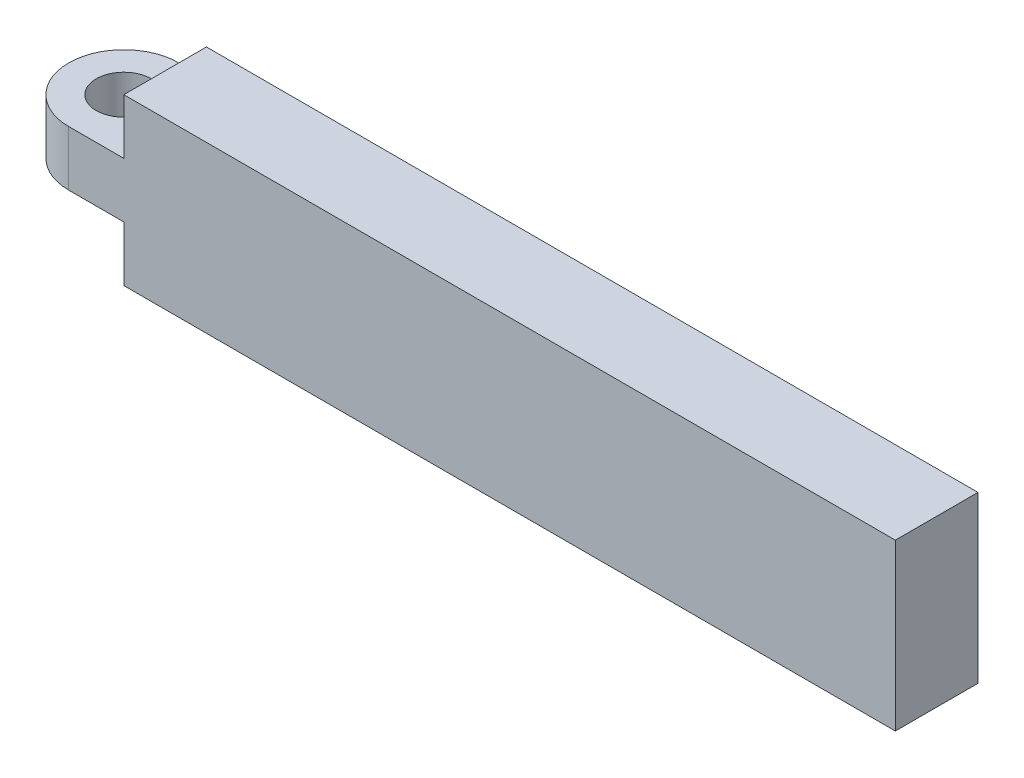
ISO-10303-21;
HEADER;
FILE_DESCRIPTION(('STEP AP214'),'2;1');
FILE_NAME('part.step','',(''),(''),'','','');
FILE_SCHEMA(('AUTOMOTIVE_DESIGN { 1 0 10303 214 1 1 1 1 }'));
ENDSEC;
DATA;
#1=APPLICATION_CONTEXT('core data for automotive mechanical design processes');
#2=APPLICATION_PROTOCOL_DEFINITION('international standard','automotive_design',2000,#1);
#3=PRODUCT_CONTEXT('',#1,'mechanical');
#4=PRODUCT('Part','Part','',(#3));
#5=PRODUCT_RELATED_PRODUCT_CATEGORY('part','',(#4));
#6=PRODUCT_DEFINITION_FORMATION('','',#4);
#7=PRODUCT_DEFINITION_CONTEXT('part definition',#1,'design');
#8=PRODUCT_DEFINITION('design','',#6,#7);
#9=PRODUCT_DEFINITION_SHAPE('','',#8);
#10=(LENGTH_UNIT() NAMED_UNIT(*) SI_UNIT(.MILLI.,.METRE.));
#11=(NAMED_UNIT(*) PLANE_ANGLE_UNIT() SI_UNIT($,.RADIAN.));
#12=(NAMED_UNIT(*) SI_UNIT($,.STERADIAN.) SOLID_ANGLE_UNIT());
#13=UNCERTAINTY_MEASURE_WITH_UNIT(LENGTH_MEASURE(1.E-05),#10,'distance_accuracy_value','');
#14=(GEOMETRIC_REPRESENTATION_CONTEXT(3) GLOBAL_UNCERTAINTY_ASSIGNED_CONTEXT((#13)) GLOBAL_UNIT_ASSIGNED_CONTEXT((#10,
#11,#12)) REPRESENTATION_CONTEXT('',''));
#15=CARTESIAN_POINT('',(0.,0.,0.));
#16=DIRECTION('',(0.,0.,1.));
#17=DIRECTION('',(1.,0.,0.));
#18=AXIS2_PLACEMENT_3D('',#15,#16,#17);
#19=CARTESIAN_POINT('',(-9.,2.,-1.));
#20=DIRECTION('',(0.,-1.,0.));
#21=DIRECTION('',(0.,0.,-1.));
#22=AXIS2_PLACEMENT_3D('',#19,#20,#21);
#23=PLANE('',#22);
#24=CARTESIAN_POINT('',(-8.,2.,0.));
#25=DIRECTION('',(0.,1.,0.));
#26=DIRECTION('',(0.,0.,1.));
#27=AXIS2_PLACEMENT_3D('',#24,#25,#26);
#28=CIRCLE('',#27,0.5);
#29=CARTESIAN_POINT('',(-8.,2.,0.5));
#30=VERTEX_POINT('',#29);
#31=EDGE_CURVE('E207',#30,#30,#28,.T.);
#32=ORIENTED_EDGE('',*,*,#31,.F.);
#33=EDGE_LOOP('',(#32));
#34=FACE_BOUND('',#33,.T.);
#35=CARTESIAN_POINT('',(-8.,2.,0.));
#36=DIRECTION('',(0.,1.,0.));
#37=DIRECTION('',(0.,0.,1.));
#38=AXIS2_PLACEMENT_3D('',#35,#36,#37);
#39=CIRCLE('',#38,1.);
#40=CARTESIAN_POINT('',(-8.,2.,-1.));
#41=VERTEX_POINT('',#40);
#42=CARTESIAN_POINT('',(-8.,2.,1.));
#43=VERTEX_POINT('',#42);
#44=EDGE_CURVE('E136',#41,#43,#39,.T.);
#45=ORIENTED_EDGE('',*,*,#44,.T.);
#46=DIRECTION('',(1.,0.,0.));
#47=VECTOR('',#46,1.);
#48=CARTESIAN_POINT('',(-9.,2.,1.));
#49=LINE('',#48,#47);
#50=CARTESIAN_POINT('',(-7.,2.,1.));
#51=VERTEX_POINT('',#50);
#52=EDGE_CURVE('E82',#43,#51,#49,.T.);
#53=ORIENTED_EDGE('',*,*,#52,.T.);
#54=DIRECTION('',(0.,0.,-1.));
#55=VECTOR('',#54,1.);
#56=CARTESIAN_POINT('',(-7.,2.,-1.));
#57=LINE('',#56,#55);
#58=CARTESIAN_POINT('',(-7.,2.,-1.));
#59=VERTEX_POINT('',#58);
#60=EDGE_CURVE('E202',#51,#59,#57,.T.);
#61=ORIENTED_EDGE('',*,*,#60,.T.);
#62=DIRECTION('',(1.,0.,0.));
#63=VECTOR('',#62,1.);
#64=CARTESIAN_POINT('',(-9.,2.,-1.));
#65=LINE('',#64,#63);
#66=EDGE_CURVE('E137',#41,#59,#65,.T.);
#67=ORIENTED_EDGE('',*,*,#66,.F.);
#68=EDGE_LOOP('',(#45,#53,#61,#67));
#69=FACE_BOUND('',#68,.T.);
#70=ADVANCED_FACE('F58',(#34,#69),#23,.F.);
#71=CARTESIAN_POINT('',(-9.,1.,-1.));
#72=DIRECTION('',(0.,1.,0.));
#73=DIRECTION('',(0.,0.,1.));
#74=AXIS2_PLACEMENT_3D('',#71,#72,#73);
#75=PLANE('',#74);
#76=CARTESIAN_POINT('',(-8.,1.,0.));
#77=DIRECTION('',(0.,1.,0.));
#78=DIRECTION('',(0.,0.,1.));
#79=AXIS2_PLACEMENT_3D('',#76,#77,#78);
#80=CIRCLE('',#79,0.5);
#81=CARTESIAN_POINT('',(-8.,1.,0.5));
#82=VERTEX_POINT('',#81);
#83=EDGE_CURVE('E200',#82,#82,#80,.T.);
#84=ORIENTED_EDGE('',*,*,#83,.T.);
#85=EDGE_LOOP('',(#84));
#86=FACE_BOUND('',#85,.T.);
#87=DIRECTION('',(1.,0.,0.));
#88=VECTOR('',#87,1.);
#89=CARTESIAN_POINT('',(-9.,1.,1.));
#90=LINE('',#89,#88);
#91=CARTESIAN_POINT('',(-8.,1.,1.));
#92=VERTEX_POINT('',#91);
#93=CARTESIAN_POINT('',(-7.,1.,1.));
#94=VERTEX_POINT('',#93);
#95=EDGE_CURVE('E74',#92,#94,#90,.T.);
#96=ORIENTED_EDGE('',*,*,#95,.F.);
#97=CARTESIAN_POINT('',(-8.,1.,0.));
#98=DIRECTION('',(0.,1.,0.));
#99=DIRECTION('',(0.,0.,1.));
#100=AXIS2_PLACEMENT_3D('',#97,#98,#99);
#101=CIRCLE('',#100,1.);
#102=CARTESIAN_POINT('',(-8.,1.,-1.));
#103=VERTEX_POINT('',#102);
#104=EDGE_CURVE('E144',#103,#92,#101,.T.);
#105=ORIENTED_EDGE('',*,*,#104,.F.);
#106=DIRECTION('',(1.,0.,0.));
#107=VECTOR('',#106,1.);
#108=CARTESIAN_POINT('',(-9.,1.,-1.));
#109=LINE('',#108,#107);
#110=CARTESIAN_POINT('',(-7.,1.,-1.));
#111=VERTEX_POINT('',#110);
#112=EDGE_CURVE('E155',#103,#111,#109,.T.);
#113=ORIENTED_EDGE('',*,*,#112,.T.);
#114=DIRECTION('',(0.,0.,1.));
#115=VECTOR('',#114,1.);
#116=CARTESIAN_POINT('',(-7.,1.,-1.));
#117=LINE('',#116,#115);
#118=EDGE_CURVE('E205',#111,#94,#117,.T.);
#119=ORIENTED_EDGE('',*,*,#118,.T.);
#120=EDGE_LOOP('',(#96,#105,#113,#119));
#121=FACE_BOUND('',#120,.T.);
#122=ADVANCED_FACE('F218',(#86,#121),#75,.F.);
#123=CARTESIAN_POINT('',(-7.,3.,1.));
#124=DIRECTION('',(0.,0.,-1.));
#125=DIRECTION('',(-1.,0.,0.));
#126=AXIS2_PLACEMENT_3D('',#123,#124,#125);
#127=PLANE('',#126);
#128=DIRECTION('',(0.,1.,0.));
#129=VECTOR('',#128,1.);
#130=CARTESIAN_POINT('',(-8.,0.,1.));
#131=LINE('',#130,#129);
#132=EDGE_CURVE('E12',#92,#43,#131,.T.);
#133=ORIENTED_EDGE('',*,*,#132,.F.);
#134=ORIENTED_EDGE('',*,*,#95,.T.);
#135=DIRECTION('',(0.,-1.,0.));
#136=VECTOR('',#135,1.);
#137=CARTESIAN_POINT('',(-7.,3.,1.));
#138=LINE('',#137,#136);
#139=CARTESIAN_POINT('',(-7.,0.,1.));
#140=VERTEX_POINT('',#139);
#141=EDGE_CURVE('E177',#94,#140,#138,.T.);
#142=ORIENTED_EDGE('',*,*,#141,.T.);
#143=DIRECTION('',(1.,0.,0.));
#144=VECTOR('',#143,1.);
#145=CARTESIAN_POINT('',(-7.,0.,1.));
#146=LINE('',#145,#144);
#147=CARTESIAN_POINT('',(7.,0.,1.));
#148=VERTEX_POINT('',#147);
#149=EDGE_CURVE('E163',#140,#148,#146,.T.);
#150=ORIENTED_EDGE('',*,*,#149,.T.);
#151=DIRECTION('',(0.,-1.,0.));
#152=VECTOR('',#151,1.);
#153=CARTESIAN_POINT('',(7.,3.,1.));
#154=LINE('',#153,#152);
#155=CARTESIAN_POINT('',(7.,3.,1.));
#156=VERTEX_POINT('',#155);
#157=EDGE_CURVE('E167',#156,#148,#154,.T.);
#158=ORIENTED_EDGE('',*,*,#157,.F.);
#159=DIRECTION('',(1.,0.,0.));
#160=VECTOR('',#159,1.);
#161=CARTESIAN_POINT('',(-7.,3.,1.));
#162=LINE('',#161,#160);
#163=CARTESIAN_POINT('',(-7.,3.,1.));
#164=VERTEX_POINT('',#163);
#165=EDGE_CURVE('E165',#164,#156,#162,.T.);
#166=ORIENTED_EDGE('',*,*,#165,.F.);
#167=EDGE_CURVE('E149',#164,#51,#138,.T.);
#168=ORIENTED_EDGE('',*,*,#167,.T.);
#169=ORIENTED_EDGE('',*,*,#52,.F.);
#170=EDGE_LOOP('',(#133,#134,#142,#150,#158,#166,#168,#169));
#171=FACE_BOUND('',#170,.T.);
#172=ADVANCED_FACE('F146',(#171),#127,.F.);
#173=CARTESIAN_POINT('',(-7.,3.,-1.));
#174=DIRECTION('',(1.,0.,0.));
#175=DIRECTION('',(0.,0.,-1.));
#176=AXIS2_PLACEMENT_3D('',#173,#174,#175);
#177=PLANE('',#176);
#178=ORIENTED_EDGE('',*,*,#118,.F.);
#179=DIRECTION('',(0.,-1.,0.));
#180=VECTOR('',#179,1.);
#181=CARTESIAN_POINT('',(-7.,3.,-1.));
#182=LINE('',#181,#180);
#183=CARTESIAN_POINT('',(-7.,0.5,-1.));
#184=VERTEX_POINT('',#183);
#185=EDGE_CURVE('E179',#111,#184,#182,.T.);
#186=ORIENTED_EDGE('',*,*,#185,.T.);
#187=DIRECTION('',(0.,0.707106781186549,-0.707106781186546));
#188=VECTOR('',#187,1.);
#189=CARTESIAN_POINT('',(-7.,0.5,-1.));
#190=LINE('',#189,#188);
#191=CARTESIAN_POINT('',(-7.,0.,-0.500000000000001));
#192=VERTEX_POINT('',#191);
#193=EDGE_CURVE('E192',#184,#192,#190,.F.);
#194=ORIENTED_EDGE('',*,*,#193,.T.);
#195=DIRECTION('',(0.,0.,1.));
#196=VECTOR('',#195,1.);
#197=CARTESIAN_POINT('',(-7.,0.,-1.));
#198=LINE('',#197,#196);
#199=EDGE_CURVE('E171',#192,#140,#198,.T.);
#200=ORIENTED_EDGE('',*,*,#199,.T.);
#201=ORIENTED_EDGE('',*,*,#141,.F.);
#202=EDGE_LOOP('',(#178,#186,#194,#200,#201));
#203=FACE_BOUND('',#202,.T.);
#204=ADVANCED_FACE('F222',(#203),#177,.F.);
#205=ORIENTED_EDGE('',*,*,#60,.F.);
#206=ORIENTED_EDGE('',*,*,#167,.F.);
#207=DIRECTION('',(0.,0.,1.));
#208=VECTOR('',#207,1.);
#209=CARTESIAN_POINT('',(-7.,3.,-1.));
#210=LINE('',#209,#208);
#211=CARTESIAN_POINT('',(-7.,3.,-0.500000000000001));
#212=VERTEX_POINT('',#211);
#213=EDGE_CURVE('E162',#212,#164,#210,.T.);
#214=ORIENTED_EDGE('',*,*,#213,.F.);
#215=DIRECTION('',(0.,-0.707106781186549,-0.707106781186546));
#216=VECTOR('',#215,1.);
#217=CARTESIAN_POINT('',(-7.,3.,-0.500000000000001));
#218=LINE('',#217,#216);
#219=CARTESIAN_POINT('',(-7.,2.5,-1.));
#220=VERTEX_POINT('',#219);
#221=EDGE_CURVE('E190',#212,#220,#218,.T.);
#222=ORIENTED_EDGE('',*,*,#221,.T.);
#223=EDGE_CURVE('E180',#220,#59,#182,.T.);
#224=ORIENTED_EDGE('',*,*,#223,.T.);
#225=EDGE_LOOP('',(#205,#206,#214,#222,#224));
#226=FACE_BOUND('',#225,.T.);
#227=ADVANCED_FACE('F276',(#226),#177,.F.);
#228=CARTESIAN_POINT('',(7.,3.,-1.));
#229=DIRECTION('',(-1.,0.,0.));
#230=DIRECTION('',(0.,0.,1.));
#231=AXIS2_PLACEMENT_3D('',#228,#229,#230);
#232=PLANE('',#231);
#233=DIRECTION('',(0.,0.,-1.));
#234=VECTOR('',#233,1.);
#235=CARTESIAN_POINT('',(7.,0.,-1.));
#236=LINE('',#235,#234);
#237=CARTESIAN_POINT('',(7.,0.,-0.500000000000001));
#238=VERTEX_POINT('',#237);
#239=EDGE_CURVE('E168',#148,#238,#236,.T.);
#240=ORIENTED_EDGE('',*,*,#239,.T.);
#241=DIRECTION('',(0.,1.,0.));
#242=VECTOR('',#241,1.);
#243=CARTESIAN_POINT('',(7.,3.,-0.500000000000001));
#244=LINE('',#243,#242);
#245=CARTESIAN_POINT('',(7.,3.,-0.500000000000001));
#246=VERTEX_POINT('',#245);
#247=EDGE_CURVE('E196',#238,#246,#244,.T.);
#248=ORIENTED_EDGE('',*,*,#247,.T.);
#249=DIRECTION('',(0.,0.,-1.));
#250=VECTOR('',#249,1.);
#251=CARTESIAN_POINT('',(7.,3.,-1.));
#252=LINE('',#251,#250);
#253=EDGE_CURVE('E159',#156,#246,#252,.T.);
#254=ORIENTED_EDGE('',*,*,#253,.F.);
#255=ORIENTED_EDGE('',*,*,#157,.T.);
#256=EDGE_LOOP('',(#240,#248,#254,#255));
#257=FACE_BOUND('',#256,.T.);
#258=ADVANCED_FACE('F239',(#257),#232,.F.);
#259=CARTESIAN_POINT('',(-7.,3.,-1.));
#260=DIRECTION('',(0.,0.,1.));
#261=DIRECTION('',(1.,0.,0.));
#262=AXIS2_PLACEMENT_3D('',#259,#260,#261);
#263=PLANE('',#262);
#264=ORIENTED_EDGE('',*,*,#112,.F.);
#265=DIRECTION('',(0.,1.,0.));
#266=VECTOR('',#265,1.);
#267=CARTESIAN_POINT('',(-8.,0.,-1.));
#268=LINE('',#267,#266);
#269=EDGE_CURVE('E140',#103,#41,#268,.T.);
#270=ORIENTED_EDGE('',*,*,#269,.T.);
#271=ORIENTED_EDGE('',*,*,#66,.T.);
#272=ORIENTED_EDGE('',*,*,#223,.F.);
#273=DIRECTION('',(1.,0.,0.));
#274=VECTOR('',#273,1.);
#275=CARTESIAN_POINT('',(7.,2.5,-1.));
#276=LINE('',#275,#274);
#277=CARTESIAN_POINT('',(6.5,2.5,-1.));
#278=VERTEX_POINT('',#277);
#279=EDGE_CURVE('E183',#220,#278,#276,.T.);
#280=ORIENTED_EDGE('',*,*,#279,.T.);
#281=DIRECTION('',(0.,-1.,0.));
#282=VECTOR('',#281,1.);
#283=CARTESIAN_POINT('',(6.5,3.,-1.));
#284=LINE('',#283,#282);
#285=CARTESIAN_POINT('',(6.5,0.5,-1.));
#286=VERTEX_POINT('',#285);
#287=EDGE_CURVE('E185',#278,#286,#284,.T.);
#288=ORIENTED_EDGE('',*,*,#287,.T.);
#289=DIRECTION('',(-1.,0.,0.));
#290=VECTOR('',#289,1.);
#291=CARTESIAN_POINT('',(-7.,0.5,-1.));
#292=LINE('',#291,#290);
#293=EDGE_CURVE('E187',#286,#184,#292,.T.);
#294=ORIENTED_EDGE('',*,*,#293,.T.);
#295=ORIENTED_EDGE('',*,*,#185,.F.);
#296=EDGE_LOOP('',(#264,#270,#271,#272,#280,#288,#294,#295));
#297=FACE_BOUND('',#296,.T.);
#298=ADVANCED_FACE('F224',(#297),#263,.F.);
#299=CARTESIAN_POINT('',(0.,3.,0.));
#300=DIRECTION('',(0.,1.,0.));
#301=DIRECTION('',(0.,0.,1.));
#302=AXIS2_PLACEMENT_3D('',#299,#300,#301);
#303=PLANE('',#302);
#304=ORIENTED_EDGE('',*,*,#253,.T.);
#305=DIRECTION('',(-1.,0.,0.));
#306=VECTOR('',#305,1.);
#307=CARTESIAN_POINT('',(-7.,3.,-0.500000000000001));
#308=LINE('',#307,#306);
#309=EDGE_CURVE('E67',#246,#212,#308,.T.);
#310=ORIENTED_EDGE('',*,*,#309,.T.);
#311=ORIENTED_EDGE('',*,*,#213,.T.);
#312=ORIENTED_EDGE('',*,*,#165,.T.);
#313=EDGE_LOOP('',(#304,#310,#311,#312));
#314=FACE_BOUND('',#313,.T.);
#315=ADVANCED_FACE('F243',(#314),#303,.T.);
#316=CARTESIAN_POINT('',(0.,0.,0.));
#317=DIRECTION('',(0.,1.,0.));
#318=DIRECTION('',(0.,0.,1.));
#319=AXIS2_PLACEMENT_3D('',#316,#317,#318);
#320=PLANE('',#319);
#321=ORIENTED_EDGE('',*,*,#199,.F.);
#322=DIRECTION('',(1.,0.,0.));
#323=VECTOR('',#322,1.);
#324=CARTESIAN_POINT('',(0.,0.,-0.500000000000001));
#325=LINE('',#324,#323);
#326=EDGE_CURVE('E194',#192,#238,#325,.T.);
#327=ORIENTED_EDGE('',*,*,#326,.T.);
#328=ORIENTED_EDGE('',*,*,#239,.F.);
#329=ORIENTED_EDGE('',*,*,#149,.F.);
#330=EDGE_LOOP('',(#321,#327,#328,#329));
#331=FACE_BOUND('',#330,.T.);
#332=ADVANCED_FACE('F234',(#331),#320,.F.);
#333=CARTESIAN_POINT('',(0.,3.,-0.500000000000001));
#334=DIRECTION('',(0.,0.707106781186546,-0.707106781186549));
#335=DIRECTION('',(1.,0.,0.));
#336=AXIS2_PLACEMENT_3D('',#333,#334,#335);
#337=PLANE('',#336);
#338=ORIENTED_EDGE('',*,*,#221,.F.);
#339=ORIENTED_EDGE('',*,*,#309,.F.);
#340=DIRECTION('',(0.577350269189626,0.577350269189627,0.577350269189625));
#341=VECTOR('',#340,1.);
#342=CARTESIAN_POINT('',(4.66666666666667,0.66666666666666,-2.83333333333333));
#343=LINE('',#342,#341);
#344=EDGE_CURVE('E153',#278,#246,#343,.T.);
#345=ORIENTED_EDGE('',*,*,#344,.F.);
#346=ORIENTED_EDGE('',*,*,#279,.F.);
#347=EDGE_LOOP('',(#338,#339,#345,#346));
#348=FACE_BOUND('',#347,.T.);
#349=ADVANCED_FACE('F61',(#348),#337,.T.);
#350=CARTESIAN_POINT('',(6.5,3.,-1.));
#351=DIRECTION('',(-0.707106781186546,0.,0.707106781186549));
#352=DIRECTION('',(0.,-1.,0.));
#353=AXIS2_PLACEMENT_3D('',#350,#351,#352);
#354=PLANE('',#353);
#355=ORIENTED_EDGE('',*,*,#344,.T.);
#356=ORIENTED_EDGE('',*,*,#247,.F.);
#357=DIRECTION('',(-0.577350269189626,0.577350269189627,-0.577350269189625));
#358=VECTOR('',#357,1.);
#359=CARTESIAN_POINT('',(5.66666666666667,1.33333333333334,-1.83333333333333));
#360=LINE('',#359,#358);
#361=EDGE_CURVE('E150',#286,#238,#360,.F.);
#362=ORIENTED_EDGE('',*,*,#361,.F.);
#363=ORIENTED_EDGE('',*,*,#287,.F.);
#364=EDGE_LOOP('',(#355,#356,#362,#363));
#365=FACE_BOUND('',#364,.T.);
#366=ADVANCED_FACE('F250',(#365),#354,.F.);
#367=CARTESIAN_POINT('',(-7.,0.5,-1.));
#368=DIRECTION('',(0.,0.707106781186546,0.707106781186549));
#369=DIRECTION('',(-1.,0.,0.));
#370=AXIS2_PLACEMENT_3D('',#367,#368,#369);
#371=PLANE('',#370);
#372=ORIENTED_EDGE('',*,*,#361,.T.);
#373=ORIENTED_EDGE('',*,*,#326,.F.);
#374=ORIENTED_EDGE('',*,*,#193,.F.);
#375=ORIENTED_EDGE('',*,*,#293,.F.);
#376=EDGE_LOOP('',(#372,#373,#374,#375));
#377=FACE_BOUND('',#376,.T.);
#378=ADVANCED_FACE('F229',(#377),#371,.F.);
#379=CARTESIAN_POINT('',(-8.,0.,0.));
#380=DIRECTION('',(0.,1.,0.));
#381=DIRECTION('',(0.,0.,1.));
#382=AXIS2_PLACEMENT_3D('',#379,#380,#381);
#383=CYLINDRICAL_SURFACE('',#382,1.);
#384=ORIENTED_EDGE('',*,*,#104,.T.);
#385=ORIENTED_EDGE('',*,*,#132,.T.);
#386=ORIENTED_EDGE('',*,*,#44,.F.);
#387=ORIENTED_EDGE('',*,*,#269,.F.);
#388=EDGE_LOOP('',(#384,#385,#386,#387));
#389=FACE_BOUND('',#388,.T.);
#390=ADVANCED_FACE('F142',(#389),#383,.T.);
#391=CARTESIAN_POINT('',(-8.,0.,0.));
#392=DIRECTION('',(0.,1.,0.));
#393=DIRECTION('',(0.,0.,1.));
#394=AXIS2_PLACEMENT_3D('',#391,#392,#393);
#395=CYLINDRICAL_SURFACE('',#394,0.5);
#396=ORIENTED_EDGE('',*,*,#31,.T.);
#397=EDGE_LOOP('',(#396));
#398=FACE_BOUND('',#397,.T.);
#399=ORIENTED_EDGE('',*,*,#83,.F.);
#400=EDGE_LOOP('',(#399));
#401=FACE_BOUND('',#400,.T.);
#402=ADVANCED_FACE('F321',(#398,#401),#395,.F.);
#403=CLOSED_SHELL('',(#70,#122,#172,#204,#227,#258,#298,#315,#332,#349,#366,#378,#390,#402));
#404=MANIFOLD_SOLID_BREP('B2',#403);
#405=ADVANCED_BREP_SHAPE_REPRESENTATION('',(#18,#404),#14);
#406=SHAPE_DEFINITION_REPRESENTATION(#9,#405);
ENDSEC;
END-ISO-10303-21;
